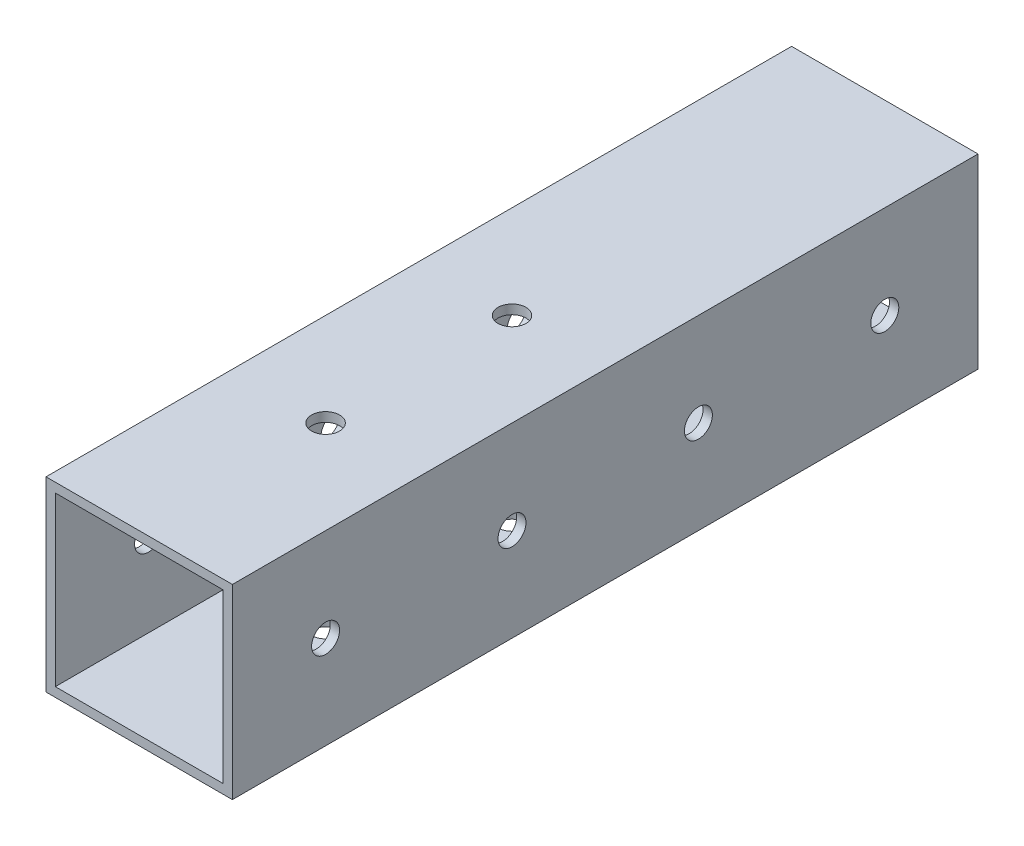
ISO-10303-21;
HEADER;
FILE_DESCRIPTION(('STEP AP214'),'2;1');
FILE_NAME('part.step','',(''),(''),'','','');
FILE_SCHEMA(('AUTOMOTIVE_DESIGN { 1 0 10303 214 1 1 1 1 }'));
ENDSEC;
DATA;
#1=APPLICATION_CONTEXT('core data for automotive mechanical design processes');
#2=APPLICATION_PROTOCOL_DEFINITION('international standard','automotive_design',2000,#1);
#3=PRODUCT_CONTEXT('',#1,'mechanical');
#4=PRODUCT('Part','Part','',(#3));
#5=PRODUCT_RELATED_PRODUCT_CATEGORY('part','',(#4));
#6=PRODUCT_DEFINITION_FORMATION('','',#4);
#7=PRODUCT_DEFINITION_CONTEXT('part definition',#1,'design');
#8=PRODUCT_DEFINITION('design','',#6,#7);
#9=PRODUCT_DEFINITION_SHAPE('','',#8);
#10=(LENGTH_UNIT() NAMED_UNIT(*) SI_UNIT(.MILLI.,.METRE.));
#11=(NAMED_UNIT(*) PLANE_ANGLE_UNIT() SI_UNIT($,.RADIAN.));
#12=(NAMED_UNIT(*) SI_UNIT($,.STERADIAN.) SOLID_ANGLE_UNIT());
#13=UNCERTAINTY_MEASURE_WITH_UNIT(LENGTH_MEASURE(1.E-05),#10,'distance_accuracy_value','');
#14=(GEOMETRIC_REPRESENTATION_CONTEXT(3) GLOBAL_UNCERTAINTY_ASSIGNED_CONTEXT((#13)) GLOBAL_UNIT_ASSIGNED_CONTEXT((#10,
#11,#12)) REPRESENTATION_CONTEXT('',''));
#15=CARTESIAN_POINT('',(0.,0.,0.));
#16=DIRECTION('',(0.,0.,1.));
#17=DIRECTION('',(1.,0.,0.));
#18=AXIS2_PLACEMENT_3D('',#15,#16,#17);
#19=CARTESIAN_POINT('',(0.,0.,40.));
#20=DIRECTION('',(0.,0.,1.));
#21=DIRECTION('',(1.,0.,0.));
#22=AXIS2_PLACEMENT_3D('',#19,#20,#21);
#23=PLANE('',#22);
#24=DIRECTION('',(0.,1.,0.));
#25=VECTOR('',#24,1.);
#26=CARTESIAN_POINT('',(10.,10.,40.));
#27=LINE('',#26,#25);
#28=CARTESIAN_POINT('',(10.,-10.,40.));
#29=VERTEX_POINT('',#28);
#30=CARTESIAN_POINT('',(10.,10.,40.));
#31=VERTEX_POINT('',#30);
#32=EDGE_CURVE('E163',#29,#31,#27,.T.);
#33=ORIENTED_EDGE('',*,*,#32,.T.);
#34=DIRECTION('',(-1.,0.,0.));
#35=VECTOR('',#34,1.);
#36=CARTESIAN_POINT('',(-10.,10.,40.));
#37=LINE('',#36,#35);
#38=CARTESIAN_POINT('',(-10.,10.,40.));
#39=VERTEX_POINT('',#38);
#40=EDGE_CURVE('E167',#31,#39,#37,.T.);
#41=ORIENTED_EDGE('',*,*,#40,.T.);
#42=DIRECTION('',(0.,-1.,0.));
#43=VECTOR('',#42,1.);
#44=CARTESIAN_POINT('',(-10.,10.,40.));
#45=LINE('',#44,#43);
#46=CARTESIAN_POINT('',(-10.,-10.,40.));
#47=VERTEX_POINT('',#46);
#48=EDGE_CURVE('E171',#39,#47,#45,.T.);
#49=ORIENTED_EDGE('',*,*,#48,.T.);
#50=DIRECTION('',(1.,0.,0.));
#51=VECTOR('',#50,1.);
#52=CARTESIAN_POINT('',(-10.,-10.,40.));
#53=LINE('',#52,#51);
#54=EDGE_CURVE('E174',#47,#29,#53,.T.);
#55=ORIENTED_EDGE('',*,*,#54,.T.);
#56=EDGE_LOOP('',(#33,#41,#49,#55));
#57=FACE_BOUND('',#56,.T.);
#58=DIRECTION('',(-1.,0.,0.));
#59=VECTOR('',#58,1.);
#60=CARTESIAN_POINT('',(-9.,9.,40.));
#61=LINE('',#60,#59);
#62=CARTESIAN_POINT('',(9.,9.,40.));
#63=VERTEX_POINT('',#62);
#64=CARTESIAN_POINT('',(-9.,9.,40.));
#65=VERTEX_POINT('',#64);
#66=EDGE_CURVE('E122',#63,#65,#61,.T.);
#67=ORIENTED_EDGE('',*,*,#66,.F.);
#68=DIRECTION('',(0.,1.,0.));
#69=VECTOR('',#68,1.);
#70=CARTESIAN_POINT('',(9.,9.,40.));
#71=LINE('',#70,#69);
#72=CARTESIAN_POINT('',(9.,-9.,40.));
#73=VERTEX_POINT('',#72);
#74=EDGE_CURVE('E113',#73,#63,#71,.T.);
#75=ORIENTED_EDGE('',*,*,#74,.F.);
#76=DIRECTION('',(1.,0.,0.));
#77=VECTOR('',#76,1.);
#78=CARTESIAN_POINT('',(-9.,-9.,40.));
#79=LINE('',#78,#77);
#80=CARTESIAN_POINT('',(-9.,-9.,40.));
#81=VERTEX_POINT('',#80);
#82=EDGE_CURVE('E139',#81,#73,#79,.T.);
#83=ORIENTED_EDGE('',*,*,#82,.F.);
#84=DIRECTION('',(0.,-1.,0.));
#85=VECTOR('',#84,1.);
#86=CARTESIAN_POINT('',(-9.,9.,40.));
#87=LINE('',#86,#85);
#88=EDGE_CURVE('E135',#65,#81,#87,.T.);
#89=ORIENTED_EDGE('',*,*,#88,.F.);
#90=EDGE_LOOP('',(#67,#75,#83,#89));
#91=FACE_BOUND('',#90,.T.);
#92=ADVANCED_FACE('F45',(#57,#91),#23,.T.);
#93=CARTESIAN_POINT('',(0.,0.,-40.));
#94=DIRECTION('',(0.,0.,1.));
#95=DIRECTION('',(1.,0.,0.));
#96=AXIS2_PLACEMENT_3D('',#93,#94,#95);
#97=PLANE('',#96);
#98=DIRECTION('',(0.,1.,0.));
#99=VECTOR('',#98,1.);
#100=CARTESIAN_POINT('',(10.,10.,-40.));
#101=LINE('',#100,#99);
#102=CARTESIAN_POINT('',(10.,-10.,-40.));
#103=VERTEX_POINT('',#102);
#104=CARTESIAN_POINT('',(10.,10.,-40.));
#105=VERTEX_POINT('',#104);
#106=EDGE_CURVE('E131',#103,#105,#101,.T.);
#107=ORIENTED_EDGE('',*,*,#106,.F.);
#108=DIRECTION('',(1.,0.,0.));
#109=VECTOR('',#108,1.);
#110=CARTESIAN_POINT('',(-10.,-10.,-40.));
#111=LINE('',#110,#109);
#112=CARTESIAN_POINT('',(-10.,-10.,-40.));
#113=VERTEX_POINT('',#112);
#114=EDGE_CURVE('E168',#113,#103,#111,.T.);
#115=ORIENTED_EDGE('',*,*,#114,.F.);
#116=DIRECTION('',(0.,-1.,0.));
#117=VECTOR('',#116,1.);
#118=CARTESIAN_POINT('',(-10.,10.,-40.));
#119=LINE('',#118,#117);
#120=CARTESIAN_POINT('',(-10.,10.,-40.));
#121=VERTEX_POINT('',#120);
#122=EDGE_CURVE('E184',#121,#113,#119,.T.);
#123=ORIENTED_EDGE('',*,*,#122,.F.);
#124=DIRECTION('',(-1.,0.,0.));
#125=VECTOR('',#124,1.);
#126=CARTESIAN_POINT('',(-10.,10.,-40.));
#127=LINE('',#126,#125);
#128=EDGE_CURVE('E181',#105,#121,#127,.T.);
#129=ORIENTED_EDGE('',*,*,#128,.F.);
#130=EDGE_LOOP('',(#107,#115,#123,#129));
#131=FACE_BOUND('',#130,.T.);
#132=DIRECTION('',(0.,1.,0.));
#133=VECTOR('',#132,1.);
#134=CARTESIAN_POINT('',(9.,9.,-40.));
#135=LINE('',#134,#133);
#136=CARTESIAN_POINT('',(9.,-9.,-40.));
#137=VERTEX_POINT('',#136);
#138=CARTESIAN_POINT('',(9.,9.,-40.));
#139=VERTEX_POINT('',#138);
#140=EDGE_CURVE('E71',#137,#139,#135,.T.);
#141=ORIENTED_EDGE('',*,*,#140,.T.);
#142=DIRECTION('',(-1.,0.,0.));
#143=VECTOR('',#142,1.);
#144=CARTESIAN_POINT('',(-9.,9.,-40.));
#145=LINE('',#144,#143);
#146=CARTESIAN_POINT('',(-9.,9.,-40.));
#147=VERTEX_POINT('',#146);
#148=EDGE_CURVE('E129',#139,#147,#145,.T.);
#149=ORIENTED_EDGE('',*,*,#148,.T.);
#150=DIRECTION('',(0.,-1.,0.));
#151=VECTOR('',#150,1.);
#152=CARTESIAN_POINT('',(-9.,9.,-40.));
#153=LINE('',#152,#151);
#154=CARTESIAN_POINT('',(-9.,-9.,-40.));
#155=VERTEX_POINT('',#154);
#156=EDGE_CURVE('E150',#147,#155,#153,.T.);
#157=ORIENTED_EDGE('',*,*,#156,.T.);
#158=DIRECTION('',(1.,0.,0.));
#159=VECTOR('',#158,1.);
#160=CARTESIAN_POINT('',(-9.,-9.,-40.));
#161=LINE('',#160,#159);
#162=EDGE_CURVE('E123',#155,#137,#161,.T.);
#163=ORIENTED_EDGE('',*,*,#162,.T.);
#164=EDGE_LOOP('',(#141,#149,#157,#163));
#165=FACE_BOUND('',#164,.T.);
#166=ADVANCED_FACE('F296',(#131,#165),#97,.F.);
#167=CARTESIAN_POINT('',(10.,10.,40.));
#168=DIRECTION('',(-1.,0.,0.));
#169=DIRECTION('',(0.,0.,1.));
#170=AXIS2_PLACEMENT_3D('',#167,#168,#169);
#171=PLANE('',#170);
#172=CARTESIAN_POINT('',(10.,0.,-30.));
#173=DIRECTION('',(-1.,0.,0.));
#174=DIRECTION('',(0.,0.,1.));
#175=AXIS2_PLACEMENT_3D('',#172,#173,#174);
#176=CIRCLE('',#175,1.5);
#177=CARTESIAN_POINT('',(10.,0.,-28.5));
#178=VERTEX_POINT('',#177);
#179=EDGE_CURVE('E250',#178,#178,#176,.T.);
#180=ORIENTED_EDGE('',*,*,#179,.T.);
#181=EDGE_LOOP('',(#180));
#182=FACE_BOUND('',#181,.T.);
#183=CARTESIAN_POINT('',(10.,0.,30.));
#184=DIRECTION('',(-1.,0.,0.));
#185=DIRECTION('',(0.,0.,1.));
#186=AXIS2_PLACEMENT_3D('',#183,#184,#185);
#187=CIRCLE('',#186,1.5);
#188=CARTESIAN_POINT('',(10.,0.,31.5));
#189=VERTEX_POINT('',#188);
#190=EDGE_CURVE('E232',#189,#189,#187,.T.);
#191=ORIENTED_EDGE('',*,*,#190,.T.);
#192=EDGE_LOOP('',(#191));
#193=FACE_BOUND('',#192,.T.);
#194=CARTESIAN_POINT('',(10.,0.,-10.));
#195=DIRECTION('',(-1.,0.,0.));
#196=DIRECTION('',(0.,0.,1.));
#197=AXIS2_PLACEMENT_3D('',#194,#195,#196);
#198=CIRCLE('',#197,1.50000000000002);
#199=CARTESIAN_POINT('',(10.,0.,-8.49999999999999));
#200=VERTEX_POINT('',#199);
#201=EDGE_CURVE('E226',#200,#200,#198,.T.);
#202=ORIENTED_EDGE('',*,*,#201,.T.);
#203=EDGE_LOOP('',(#202));
#204=FACE_BOUND('',#203,.T.);
#205=CARTESIAN_POINT('',(10.,0.,10.));
#206=DIRECTION('',(-1.,0.,0.));
#207=DIRECTION('',(0.,0.,1.));
#208=AXIS2_PLACEMENT_3D('',#205,#206,#207);
#209=CIRCLE('',#208,1.50000000000002);
#210=CARTESIAN_POINT('',(10.,0.,11.5));
#211=VERTEX_POINT('',#210);
#212=EDGE_CURVE('E221',#211,#211,#209,.T.);
#213=ORIENTED_EDGE('',*,*,#212,.T.);
#214=EDGE_LOOP('',(#213));
#215=FACE_BOUND('',#214,.T.);
#216=ORIENTED_EDGE('',*,*,#106,.T.);
#217=DIRECTION('',(0.,0.,-1.));
#218=VECTOR('',#217,1.);
#219=CARTESIAN_POINT('',(10.,10.,40.));
#220=LINE('',#219,#218);
#221=EDGE_CURVE('E11',#31,#105,#220,.T.);
#222=ORIENTED_EDGE('',*,*,#221,.F.);
#223=ORIENTED_EDGE('',*,*,#32,.F.);
#224=DIRECTION('',(0.,0.,-1.));
#225=VECTOR('',#224,1.);
#226=CARTESIAN_POINT('',(10.,-10.,40.));
#227=LINE('',#226,#225);
#228=EDGE_CURVE('E177',#29,#103,#227,.T.);
#229=ORIENTED_EDGE('',*,*,#228,.T.);
#230=EDGE_LOOP('',(#216,#222,#223,#229));
#231=FACE_BOUND('',#230,.T.);
#232=ADVANCED_FACE('F47',(#182,#193,#204,#215,#231),#171,.F.);
#233=CARTESIAN_POINT('',(-10.,10.,40.));
#234=DIRECTION('',(0.,-1.,0.));
#235=DIRECTION('',(0.,0.,-1.));
#236=AXIS2_PLACEMENT_3D('',#233,#234,#235);
#237=PLANE('',#236);
#238=CARTESIAN_POINT('',(0.,10.,20.));
#239=DIRECTION('',(0.,1.,0.));
#240=DIRECTION('',(0.,0.,1.));
#241=AXIS2_PLACEMENT_3D('',#238,#239,#240);
#242=CIRCLE('',#241,1.5);
#243=CARTESIAN_POINT('',(0.,10.,21.5));
#244=VERTEX_POINT('',#243);
#245=EDGE_CURVE('E204',#244,#244,#242,.T.);
#246=ORIENTED_EDGE('',*,*,#245,.F.);
#247=EDGE_LOOP('',(#246));
#248=FACE_BOUND('',#247,.T.);
#249=CARTESIAN_POINT('',(0.,10.,0.));
#250=DIRECTION('',(0.,1.,0.));
#251=DIRECTION('',(0.,0.,1.));
#252=AXIS2_PLACEMENT_3D('',#249,#250,#251);
#253=CIRCLE('',#252,1.5);
#254=CARTESIAN_POINT('',(0.,10.,1.5));
#255=VERTEX_POINT('',#254);
#256=EDGE_CURVE('E254',#255,#255,#253,.T.);
#257=ORIENTED_EDGE('',*,*,#256,.F.);
#258=EDGE_LOOP('',(#257));
#259=FACE_BOUND('',#258,.T.);
#260=ORIENTED_EDGE('',*,*,#128,.T.);
#261=DIRECTION('',(0.,0.,-1.));
#262=VECTOR('',#261,1.);
#263=CARTESIAN_POINT('',(-10.,10.,40.));
#264=LINE('',#263,#262);
#265=EDGE_CURVE('E55',#39,#121,#264,.T.);
#266=ORIENTED_EDGE('',*,*,#265,.F.);
#267=ORIENTED_EDGE('',*,*,#40,.F.);
#268=ORIENTED_EDGE('',*,*,#221,.T.);
#269=EDGE_LOOP('',(#260,#266,#267,#268));
#270=FACE_BOUND('',#269,.T.);
#271=ADVANCED_FACE('F311',(#248,#259,#270),#237,.F.);
#272=CARTESIAN_POINT('',(-10.,10.,40.));
#273=DIRECTION('',(1.,0.,0.));
#274=DIRECTION('',(0.,0.,-1.));
#275=AXIS2_PLACEMENT_3D('',#272,#273,#274);
#276=PLANE('',#275);
#277=CARTESIAN_POINT('',(-10.,0.,-30.));
#278=DIRECTION('',(-1.,0.,0.));
#279=DIRECTION('',(0.,0.,1.));
#280=AXIS2_PLACEMENT_3D('',#277,#278,#279);
#281=CIRCLE('',#280,1.5);
#282=CARTESIAN_POINT('',(-10.,0.,-28.5));
#283=VERTEX_POINT('',#282);
#284=EDGE_CURVE('E380',#283,#283,#281,.T.);
#285=ORIENTED_EDGE('',*,*,#284,.F.);
#286=EDGE_LOOP('',(#285));
#287=FACE_BOUND('',#286,.T.);
#288=CARTESIAN_POINT('',(-10.,0.,30.));
#289=DIRECTION('',(-1.,0.,0.));
#290=DIRECTION('',(0.,0.,1.));
#291=AXIS2_PLACEMENT_3D('',#288,#289,#290);
#292=CIRCLE('',#291,1.5);
#293=CARTESIAN_POINT('',(-10.,0.,31.5));
#294=VERTEX_POINT('',#293);
#295=EDGE_CURVE('E384',#294,#294,#292,.T.);
#296=ORIENTED_EDGE('',*,*,#295,.F.);
#297=EDGE_LOOP('',(#296));
#298=FACE_BOUND('',#297,.T.);
#299=CARTESIAN_POINT('',(-10.,0.,-10.));
#300=DIRECTION('',(-1.,0.,0.));
#301=DIRECTION('',(0.,0.,1.));
#302=AXIS2_PLACEMENT_3D('',#299,#300,#301);
#303=CIRCLE('',#302,1.50000000000002);
#304=CARTESIAN_POINT('',(-10.,0.,-8.49999999999999));
#305=VERTEX_POINT('',#304);
#306=EDGE_CURVE('E379',#305,#305,#303,.T.);
#307=ORIENTED_EDGE('',*,*,#306,.F.);
#308=EDGE_LOOP('',(#307));
#309=FACE_BOUND('',#308,.T.);
#310=CARTESIAN_POINT('',(-10.,0.,10.));
#311=DIRECTION('',(-1.,0.,0.));
#312=DIRECTION('',(0.,0.,1.));
#313=AXIS2_PLACEMENT_3D('',#310,#311,#312);
#314=CIRCLE('',#313,1.50000000000002);
#315=CARTESIAN_POINT('',(-10.,0.,11.5));
#316=VERTEX_POINT('',#315);
#317=EDGE_CURVE('E216',#316,#316,#314,.T.);
#318=ORIENTED_EDGE('',*,*,#317,.F.);
#319=EDGE_LOOP('',(#318));
#320=FACE_BOUND('',#319,.T.);
#321=ORIENTED_EDGE('',*,*,#122,.T.);
#322=DIRECTION('',(0.,0.,-1.));
#323=VECTOR('',#322,1.);
#324=CARTESIAN_POINT('',(-10.,-10.,40.));
#325=LINE('',#324,#323);
#326=EDGE_CURVE('E192',#47,#113,#325,.T.);
#327=ORIENTED_EDGE('',*,*,#326,.F.);
#328=ORIENTED_EDGE('',*,*,#48,.F.);
#329=ORIENTED_EDGE('',*,*,#265,.T.);
#330=EDGE_LOOP('',(#321,#327,#328,#329));
#331=FACE_BOUND('',#330,.T.);
#332=ADVANCED_FACE('F309',(#287,#298,#309,#320,#331),#276,.F.);
#333=CARTESIAN_POINT('',(-10.,-10.,40.));
#334=DIRECTION('',(0.,1.,0.));
#335=DIRECTION('',(0.,0.,1.));
#336=AXIS2_PLACEMENT_3D('',#333,#334,#335);
#337=PLANE('',#336);
#338=CARTESIAN_POINT('',(0.,-10.,20.));
#339=DIRECTION('',(0.,1.,0.));
#340=DIRECTION('',(0.,0.,1.));
#341=AXIS2_PLACEMENT_3D('',#338,#339,#340);
#342=CIRCLE('',#341,1.5);
#343=CARTESIAN_POINT('',(0.,-10.,21.5));
#344=VERTEX_POINT('',#343);
#345=EDGE_CURVE('E147',#344,#344,#342,.T.);
#346=ORIENTED_EDGE('',*,*,#345,.T.);
#347=EDGE_LOOP('',(#346));
#348=FACE_BOUND('',#347,.T.);
#349=CARTESIAN_POINT('',(0.,-10.,0.));
#350=DIRECTION('',(0.,1.,0.));
#351=DIRECTION('',(0.,0.,1.));
#352=AXIS2_PLACEMENT_3D('',#349,#350,#351);
#353=CIRCLE('',#352,1.5);
#354=CARTESIAN_POINT('',(0.,-10.,1.5));
#355=VERTEX_POINT('',#354);
#356=EDGE_CURVE('E210',#355,#355,#353,.T.);
#357=ORIENTED_EDGE('',*,*,#356,.T.);
#358=EDGE_LOOP('',(#357));
#359=FACE_BOUND('',#358,.T.);
#360=ORIENTED_EDGE('',*,*,#114,.T.);
#361=ORIENTED_EDGE('',*,*,#228,.F.);
#362=ORIENTED_EDGE('',*,*,#54,.F.);
#363=ORIENTED_EDGE('',*,*,#326,.T.);
#364=EDGE_LOOP('',(#360,#361,#362,#363));
#365=FACE_BOUND('',#364,.T.);
#366=ADVANCED_FACE('F273',(#348,#359,#365),#337,.F.);
#367=CARTESIAN_POINT('',(9.,9.,40.));
#368=DIRECTION('',(-1.,0.,0.));
#369=DIRECTION('',(0.,0.,1.));
#370=AXIS2_PLACEMENT_3D('',#367,#368,#369);
#371=PLANE('',#370);
#372=CARTESIAN_POINT('',(9.,0.,-30.));
#373=DIRECTION('',(-1.,0.,0.));
#374=DIRECTION('',(0.,0.,1.));
#375=AXIS2_PLACEMENT_3D('',#372,#373,#374);
#376=CIRCLE('',#375,1.5);
#377=CARTESIAN_POINT('',(9.,0.,-28.5));
#378=VERTEX_POINT('',#377);
#379=EDGE_CURVE('E246',#378,#378,#376,.T.);
#380=ORIENTED_EDGE('',*,*,#379,.F.);
#381=EDGE_LOOP('',(#380));
#382=FACE_BOUND('',#381,.T.);
#383=CARTESIAN_POINT('',(9.,0.,30.));
#384=DIRECTION('',(-1.,0.,0.));
#385=DIRECTION('',(0.,0.,1.));
#386=AXIS2_PLACEMENT_3D('',#383,#384,#385);
#387=CIRCLE('',#386,1.5);
#388=CARTESIAN_POINT('',(9.,0.,31.5));
#389=VERTEX_POINT('',#388);
#390=EDGE_CURVE('E225',#389,#389,#387,.T.);
#391=ORIENTED_EDGE('',*,*,#390,.F.);
#392=EDGE_LOOP('',(#391));
#393=FACE_BOUND('',#392,.T.);
#394=CARTESIAN_POINT('',(9.,0.,-10.));
#395=DIRECTION('',(-1.,0.,0.));
#396=DIRECTION('',(0.,0.,1.));
#397=AXIS2_PLACEMENT_3D('',#394,#395,#396);
#398=CIRCLE('',#397,1.50000000000002);
#399=CARTESIAN_POINT('',(9.,0.,-8.49999999999999));
#400=VERTEX_POINT('',#399);
#401=EDGE_CURVE('E220',#400,#400,#398,.T.);
#402=ORIENTED_EDGE('',*,*,#401,.F.);
#403=EDGE_LOOP('',(#402));
#404=FACE_BOUND('',#403,.T.);
#405=CARTESIAN_POINT('',(9.,0.,10.));
#406=DIRECTION('',(-1.,0.,0.));
#407=DIRECTION('',(0.,0.,1.));
#408=AXIS2_PLACEMENT_3D('',#405,#406,#407);
#409=CIRCLE('',#408,1.50000000000002);
#410=CARTESIAN_POINT('',(9.,0.,11.5));
#411=VERTEX_POINT('',#410);
#412=EDGE_CURVE('E215',#411,#411,#409,.T.);
#413=ORIENTED_EDGE('',*,*,#412,.F.);
#414=EDGE_LOOP('',(#413));
#415=FACE_BOUND('',#414,.T.);
#416=ORIENTED_EDGE('',*,*,#140,.F.);
#417=DIRECTION('',(0.,0.,-1.));
#418=VECTOR('',#417,1.);
#419=CARTESIAN_POINT('',(9.,-9.,40.));
#420=LINE('',#419,#418);
#421=EDGE_CURVE('E117',#73,#137,#420,.T.);
#422=ORIENTED_EDGE('',*,*,#421,.F.);
#423=ORIENTED_EDGE('',*,*,#74,.T.);
#424=DIRECTION('',(0.,0.,-1.));
#425=VECTOR('',#424,1.);
#426=CARTESIAN_POINT('',(9.,9.,40.));
#427=LINE('',#426,#425);
#428=EDGE_CURVE('E116',#63,#139,#427,.T.);
#429=ORIENTED_EDGE('',*,*,#428,.T.);
#430=EDGE_LOOP('',(#416,#422,#423,#429));
#431=FACE_BOUND('',#430,.T.);
#432=ADVANCED_FACE('F115',(#382,#393,#404,#415,#431),#371,.T.);
#433=CARTESIAN_POINT('',(-9.,9.,40.));
#434=DIRECTION('',(0.,-1.,0.));
#435=DIRECTION('',(0.,0.,-1.));
#436=AXIS2_PLACEMENT_3D('',#433,#434,#435);
#437=PLANE('',#436);
#438=CARTESIAN_POINT('',(0.,9.00000000000001,20.));
#439=DIRECTION('',(0.,-1.,0.));
#440=DIRECTION('',(0.,0.,-1.));
#441=AXIS2_PLACEMENT_3D('',#438,#439,#440);
#442=CIRCLE('',#441,1.5);
#443=CARTESIAN_POINT('',(0.,9.00000000000001,18.5));
#444=VERTEX_POINT('',#443);
#445=EDGE_CURVE('E209',#444,#444,#442,.T.);
#446=ORIENTED_EDGE('',*,*,#445,.F.);
#447=EDGE_LOOP('',(#446));
#448=FACE_BOUND('',#447,.T.);
#449=CARTESIAN_POINT('',(0.,9.00000000000001,0.));
#450=DIRECTION('',(0.,-1.,0.));
#451=DIRECTION('',(0.,0.,-1.));
#452=AXIS2_PLACEMENT_3D('',#449,#450,#451);
#453=CIRCLE('',#452,1.5);
#454=CARTESIAN_POINT('',(0.,9.00000000000001,-1.5));
#455=VERTEX_POINT('',#454);
#456=EDGE_CURVE('E203',#455,#455,#453,.T.);
#457=ORIENTED_EDGE('',*,*,#456,.F.);
#458=EDGE_LOOP('',(#457));
#459=FACE_BOUND('',#458,.T.);
#460=ORIENTED_EDGE('',*,*,#148,.F.);
#461=ORIENTED_EDGE('',*,*,#428,.F.);
#462=ORIENTED_EDGE('',*,*,#66,.T.);
#463=DIRECTION('',(0.,0.,-1.));
#464=VECTOR('',#463,1.);
#465=CARTESIAN_POINT('',(-9.,9.,40.));
#466=LINE('',#465,#464);
#467=EDGE_CURVE('E132',#65,#147,#466,.T.);
#468=ORIENTED_EDGE('',*,*,#467,.T.);
#469=EDGE_LOOP('',(#460,#461,#462,#468));
#470=FACE_BOUND('',#469,.T.);
#471=ADVANCED_FACE('F126',(#448,#459,#470),#437,.T.);
#472=CARTESIAN_POINT('',(-9.,9.,40.));
#473=DIRECTION('',(1.,0.,0.));
#474=DIRECTION('',(0.,0.,-1.));
#475=AXIS2_PLACEMENT_3D('',#472,#473,#474);
#476=PLANE('',#475);
#477=CARTESIAN_POINT('',(-9.,0.,-30.));
#478=DIRECTION('',(1.,0.,0.));
#479=DIRECTION('',(0.,0.,-1.));
#480=AXIS2_PLACEMENT_3D('',#477,#478,#479);
#481=CIRCLE('',#480,1.5);
#482=CARTESIAN_POINT('',(-9.,0.,-31.5));
#483=VERTEX_POINT('',#482);
#484=EDGE_CURVE('E49',#483,#483,#481,.T.);
#485=ORIENTED_EDGE('',*,*,#484,.F.);
#486=EDGE_LOOP('',(#485));
#487=FACE_BOUND('',#486,.T.);
#488=CARTESIAN_POINT('',(-9.,0.,30.));
#489=DIRECTION('',(1.,0.,0.));
#490=DIRECTION('',(0.,0.,-1.));
#491=AXIS2_PLACEMENT_3D('',#488,#489,#490);
#492=CIRCLE('',#491,1.5);
#493=CARTESIAN_POINT('',(-9.,0.,28.5));
#494=VERTEX_POINT('',#493);
#495=EDGE_CURVE('E222',#494,#494,#492,.T.);
#496=ORIENTED_EDGE('',*,*,#495,.F.);
#497=EDGE_LOOP('',(#496));
#498=FACE_BOUND('',#497,.T.);
#499=CARTESIAN_POINT('',(-9.,0.,-10.));
#500=DIRECTION('',(1.,0.,0.));
#501=DIRECTION('',(0.,0.,-1.));
#502=AXIS2_PLACEMENT_3D('',#499,#500,#501);
#503=CIRCLE('',#502,1.50000000000002);
#504=CARTESIAN_POINT('',(-9.,0.,-11.5));
#505=VERTEX_POINT('',#504);
#506=EDGE_CURVE('E217',#505,#505,#503,.T.);
#507=ORIENTED_EDGE('',*,*,#506,.F.);
#508=EDGE_LOOP('',(#507));
#509=FACE_BOUND('',#508,.T.);
#510=CARTESIAN_POINT('',(-9.,0.,10.));
#511=DIRECTION('',(1.,0.,0.));
#512=DIRECTION('',(0.,0.,-1.));
#513=AXIS2_PLACEMENT_3D('',#510,#511,#512);
#514=CIRCLE('',#513,1.50000000000002);
#515=CARTESIAN_POINT('',(-9.,0.,8.49999999999999));
#516=VERTEX_POINT('',#515);
#517=EDGE_CURVE('E211',#516,#516,#514,.T.);
#518=ORIENTED_EDGE('',*,*,#517,.F.);
#519=EDGE_LOOP('',(#518));
#520=FACE_BOUND('',#519,.T.);
#521=ORIENTED_EDGE('',*,*,#156,.F.);
#522=ORIENTED_EDGE('',*,*,#467,.F.);
#523=ORIENTED_EDGE('',*,*,#88,.T.);
#524=DIRECTION('',(0.,0.,-1.));
#525=VECTOR('',#524,1.);
#526=CARTESIAN_POINT('',(-9.,-9.,40.));
#527=LINE('',#526,#525);
#528=EDGE_CURVE('E63',#81,#155,#527,.T.);
#529=ORIENTED_EDGE('',*,*,#528,.T.);
#530=EDGE_LOOP('',(#521,#522,#523,#529));
#531=FACE_BOUND('',#530,.T.);
#532=ADVANCED_FACE('F339',(#487,#498,#509,#520,#531),#476,.T.);
#533=CARTESIAN_POINT('',(-9.,-9.,40.));
#534=DIRECTION('',(0.,1.,0.));
#535=DIRECTION('',(0.,0.,1.));
#536=AXIS2_PLACEMENT_3D('',#533,#534,#535);
#537=PLANE('',#536);
#538=CARTESIAN_POINT('',(0.,-9.00000000000001,20.));
#539=DIRECTION('',(0.,1.,0.));
#540=DIRECTION('',(0.,0.,1.));
#541=AXIS2_PLACEMENT_3D('',#538,#539,#540);
#542=CIRCLE('',#541,1.5);
#543=CARTESIAN_POINT('',(0.,-9.00000000000001,21.5));
#544=VERTEX_POINT('',#543);
#545=EDGE_CURVE('E205',#544,#544,#542,.T.);
#546=ORIENTED_EDGE('',*,*,#545,.F.);
#547=EDGE_LOOP('',(#546));
#548=FACE_BOUND('',#547,.T.);
#549=CARTESIAN_POINT('',(0.,-9.00000000000001,0.));
#550=DIRECTION('',(0.,1.,0.));
#551=DIRECTION('',(0.,0.,1.));
#552=AXIS2_PLACEMENT_3D('',#549,#550,#551);
#553=CIRCLE('',#552,1.5);
#554=CARTESIAN_POINT('',(0.,-9.00000000000001,1.5));
#555=VERTEX_POINT('',#554);
#556=EDGE_CURVE('E199',#555,#555,#553,.T.);
#557=ORIENTED_EDGE('',*,*,#556,.F.);
#558=EDGE_LOOP('',(#557));
#559=FACE_BOUND('',#558,.T.);
#560=ORIENTED_EDGE('',*,*,#162,.F.);
#561=ORIENTED_EDGE('',*,*,#528,.F.);
#562=ORIENTED_EDGE('',*,*,#82,.T.);
#563=ORIENTED_EDGE('',*,*,#421,.T.);
#564=EDGE_LOOP('',(#560,#561,#562,#563));
#565=FACE_BOUND('',#564,.T.);
#566=ADVANCED_FACE('F289',(#548,#559,#565),#537,.T.);
#567=CARTESIAN_POINT('',(0.,-190.,0.));
#568=DIRECTION('',(0.,1.,0.));
#569=DIRECTION('',(0.,0.,1.));
#570=AXIS2_PLACEMENT_3D('',#567,#568,#569);
#571=CYLINDRICAL_SURFACE('',#570,1.5);
#572=ORIENTED_EDGE('',*,*,#556,.T.);
#573=EDGE_LOOP('',(#572));
#574=FACE_BOUND('',#573,.T.);
#575=ORIENTED_EDGE('',*,*,#356,.F.);
#576=EDGE_LOOP('',(#575));
#577=FACE_BOUND('',#576,.T.);
#578=ADVANCED_FACE('F279',(#574,#577),#571,.F.);
#579=CARTESIAN_POINT('',(0.,-190.,20.));
#580=DIRECTION('',(0.,1.,0.));
#581=DIRECTION('',(0.,0.,1.));
#582=AXIS2_PLACEMENT_3D('',#579,#580,#581);
#583=CYLINDRICAL_SURFACE('',#582,1.5);
#584=ORIENTED_EDGE('',*,*,#545,.T.);
#585=EDGE_LOOP('',(#584));
#586=FACE_BOUND('',#585,.T.);
#587=ORIENTED_EDGE('',*,*,#345,.F.);
#588=EDGE_LOOP('',(#587));
#589=FACE_BOUND('',#588,.T.);
#590=ADVANCED_FACE('F276',(#586,#589),#583,.F.);
#591=ORIENTED_EDGE('',*,*,#456,.T.);
#592=EDGE_LOOP('',(#591));
#593=FACE_BOUND('',#592,.T.);
#594=ORIENTED_EDGE('',*,*,#256,.T.);
#595=EDGE_LOOP('',(#594));
#596=FACE_BOUND('',#595,.T.);
#597=ADVANCED_FACE('F278',(#593,#596),#571,.F.);
#598=ORIENTED_EDGE('',*,*,#445,.T.);
#599=EDGE_LOOP('',(#598));
#600=FACE_BOUND('',#599,.T.);
#601=ORIENTED_EDGE('',*,*,#245,.T.);
#602=EDGE_LOOP('',(#601));
#603=FACE_BOUND('',#602,.T.);
#604=ADVANCED_FACE('F282',(#600,#603),#583,.F.);
#605=CARTESIAN_POINT('',(30.,0.,10.));
#606=DIRECTION('',(-1.,0.,0.));
#607=DIRECTION('',(0.,0.,1.));
#608=AXIS2_PLACEMENT_3D('',#605,#606,#607);
#609=CYLINDRICAL_SURFACE('',#608,1.50000000000002);
#610=ORIENTED_EDGE('',*,*,#517,.T.);
#611=EDGE_LOOP('',(#610));
#612=FACE_BOUND('',#611,.T.);
#613=ORIENTED_EDGE('',*,*,#317,.T.);
#614=EDGE_LOOP('',(#613));
#615=FACE_BOUND('',#614,.T.);
#616=ADVANCED_FACE('F293',(#612,#615),#609,.F.);
#617=CARTESIAN_POINT('',(30.,0.,-10.));
#618=DIRECTION('',(-1.,0.,0.));
#619=DIRECTION('',(0.,0.,1.));
#620=AXIS2_PLACEMENT_3D('',#617,#618,#619);
#621=CYLINDRICAL_SURFACE('',#620,1.50000000000002);
#622=ORIENTED_EDGE('',*,*,#506,.T.);
#623=EDGE_LOOP('',(#622));
#624=FACE_BOUND('',#623,.T.);
#625=ORIENTED_EDGE('',*,*,#306,.T.);
#626=EDGE_LOOP('',(#625));
#627=FACE_BOUND('',#626,.T.);
#628=ADVANCED_FACE('F392',(#624,#627),#621,.F.);
#629=CARTESIAN_POINT('',(30.,0.,30.));
#630=DIRECTION('',(-1.,0.,0.));
#631=DIRECTION('',(0.,0.,1.));
#632=AXIS2_PLACEMENT_3D('',#629,#630,#631);
#633=CYLINDRICAL_SURFACE('',#632,1.5);
#634=ORIENTED_EDGE('',*,*,#495,.T.);
#635=EDGE_LOOP('',(#634));
#636=FACE_BOUND('',#635,.T.);
#637=ORIENTED_EDGE('',*,*,#295,.T.);
#638=EDGE_LOOP('',(#637));
#639=FACE_BOUND('',#638,.T.);
#640=ADVANCED_FACE('F403',(#636,#639),#633,.F.);
#641=CARTESIAN_POINT('',(30.,0.,-30.));
#642=DIRECTION('',(-1.,0.,0.));
#643=DIRECTION('',(0.,0.,1.));
#644=AXIS2_PLACEMENT_3D('',#641,#642,#643);
#645=CYLINDRICAL_SURFACE('',#644,1.5);
#646=ORIENTED_EDGE('',*,*,#484,.T.);
#647=EDGE_LOOP('',(#646));
#648=FACE_BOUND('',#647,.T.);
#649=ORIENTED_EDGE('',*,*,#284,.T.);
#650=EDGE_LOOP('',(#649));
#651=FACE_BOUND('',#650,.T.);
#652=ADVANCED_FACE('F409',(#648,#651),#645,.F.);
#653=ORIENTED_EDGE('',*,*,#412,.T.);
#654=EDGE_LOOP('',(#653));
#655=FACE_BOUND('',#654,.T.);
#656=ORIENTED_EDGE('',*,*,#212,.F.);
#657=EDGE_LOOP('',(#656));
#658=FACE_BOUND('',#657,.T.);
#659=ADVANCED_FACE('F399',(#655,#658),#609,.F.);
#660=ORIENTED_EDGE('',*,*,#401,.T.);
#661=EDGE_LOOP('',(#660));
#662=FACE_BOUND('',#661,.T.);
#663=ORIENTED_EDGE('',*,*,#201,.F.);
#664=EDGE_LOOP('',(#663));
#665=FACE_BOUND('',#664,.T.);
#666=ADVANCED_FACE('F406',(#662,#665),#621,.F.);
#667=ORIENTED_EDGE('',*,*,#390,.T.);
#668=EDGE_LOOP('',(#667));
#669=FACE_BOUND('',#668,.T.);
#670=ORIENTED_EDGE('',*,*,#190,.F.);
#671=EDGE_LOOP('',(#670));
#672=FACE_BOUND('',#671,.T.);
#673=ADVANCED_FACE('F414',(#669,#672),#633,.F.);
#674=ORIENTED_EDGE('',*,*,#379,.T.);
#675=EDGE_LOOP('',(#674));
#676=FACE_BOUND('',#675,.T.);
#677=ORIENTED_EDGE('',*,*,#179,.F.);
#678=EDGE_LOOP('',(#677));
#679=FACE_BOUND('',#678,.T.);
#680=ADVANCED_FACE('F417',(#676,#679),#645,.F.);
#681=CLOSED_SHELL('',(#92,#166,#232,#271,#332,#366,#432,#471,#532,#566,#578,#590,#597,#604,#616,
#628,#640,#652,#659,#666,#673,#680));
#682=MANIFOLD_SOLID_BREP('B2',#681);
#683=ADVANCED_BREP_SHAPE_REPRESENTATION('',(#18,#682),#14);
#684=SHAPE_DEFINITION_REPRESENTATION(#9,#683);
ENDSEC;
END-ISO-10303-21;
